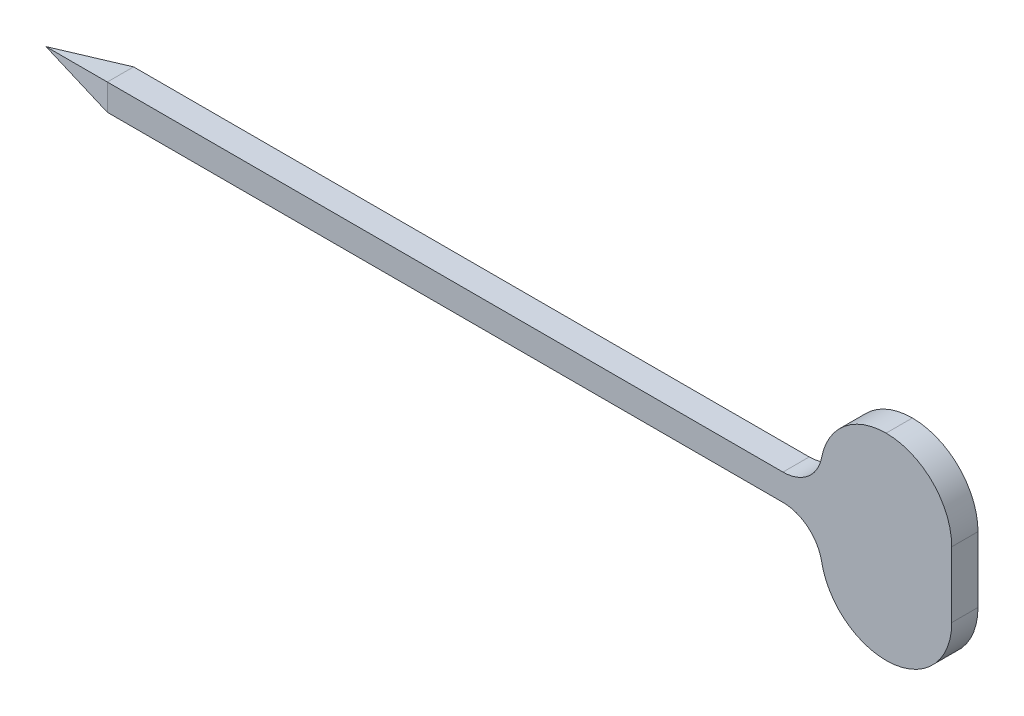
ISO-10303-21;
HEADER;
FILE_DESCRIPTION(('STEP AP214'),'2;1');
FILE_NAME('part.step','',(''),(''),'','','');
FILE_SCHEMA(('AUTOMOTIVE_DESIGN { 1 0 10303 214 1 1 1 1 }'));
ENDSEC;
DATA;
#1=APPLICATION_CONTEXT('core data for automotive mechanical design processes');
#2=APPLICATION_PROTOCOL_DEFINITION('international standard','automotive_design',2000,#1);
#3=PRODUCT_CONTEXT('',#1,'mechanical');
#4=PRODUCT('Part','Part','',(#3));
#5=PRODUCT_RELATED_PRODUCT_CATEGORY('part','',(#4));
#6=PRODUCT_DEFINITION_FORMATION('','',#4);
#7=PRODUCT_DEFINITION_CONTEXT('part definition',#1,'design');
#8=PRODUCT_DEFINITION('design','',#6,#7);
#9=PRODUCT_DEFINITION_SHAPE('','',#8);
#10=(LENGTH_UNIT() NAMED_UNIT(*) SI_UNIT(.MILLI.,.METRE.));
#11=(NAMED_UNIT(*) PLANE_ANGLE_UNIT() SI_UNIT($,.RADIAN.));
#12=(NAMED_UNIT(*) SI_UNIT($,.STERADIAN.) SOLID_ANGLE_UNIT());
#13=UNCERTAINTY_MEASURE_WITH_UNIT(LENGTH_MEASURE(1.E-05),#10,'distance_accuracy_value','');
#14=(GEOMETRIC_REPRESENTATION_CONTEXT(3) GLOBAL_UNCERTAINTY_ASSIGNED_CONTEXT((#13)) GLOBAL_UNIT_ASSIGNED_CONTEXT((#10,
#11,#12)) REPRESENTATION_CONTEXT('',''));
#15=CARTESIAN_POINT('',(0.,0.,0.));
#16=DIRECTION('',(0.,0.,1.));
#17=DIRECTION('',(1.,0.,0.));
#18=AXIS2_PLACEMENT_3D('',#15,#16,#17);
#19=CARTESIAN_POINT('',(0.,-1.,2.));
#20=DIRECTION('',(0.,-1.,0.));
#21=DIRECTION('',(1.,0.,0.));
#22=AXIS2_PLACEMENT_3D('',#19,#20,#21);
#23=PLANE('',#22);
#24=DIRECTION('',(-1.,0.,0.));
#25=VECTOR('',#24,1.);
#26=CARTESIAN_POINT('',(0.,-1.,0.));
#27=LINE('',#26,#25);
#28=CARTESIAN_POINT('',(27.1418831772491,-0.999999999999996,0.));
#29=VERTEX_POINT('',#28);
#30=CARTESIAN_POINT('',(-24.3287181803823,-1.,0.));
#31=VERTEX_POINT('',#30);
#32=EDGE_CURVE('E144',#29,#31,#27,.T.);
#33=ORIENTED_EDGE('',*,*,#32,.F.);
#34=DIRECTION('',(0.,0.,1.));
#35=VECTOR('',#34,1.);
#36=CARTESIAN_POINT('',(27.1418831772491,-0.999999999999996,2.));
#37=LINE('',#36,#35);
#38=CARTESIAN_POINT('',(27.1418831772491,-0.999999999999996,2.));
#39=VERTEX_POINT('',#38);
#40=EDGE_CURVE('E71',#29,#39,#37,.T.);
#41=ORIENTED_EDGE('',*,*,#40,.T.);
#42=DIRECTION('',(-1.,0.,0.));
#43=VECTOR('',#42,1.);
#44=CARTESIAN_POINT('',(0.,-1.,2.));
#45=LINE('',#44,#43);
#46=CARTESIAN_POINT('',(-24.3287181803823,-1.,2.));
#47=VERTEX_POINT('',#46);
#48=EDGE_CURVE('E138',#39,#47,#45,.T.);
#49=ORIENTED_EDGE('',*,*,#48,.T.);
#50=DIRECTION('',(0.,0.,-1.));
#51=VECTOR('',#50,1.);
#52=CARTESIAN_POINT('',(-24.3287181803823,-1.,2.));
#53=LINE('',#52,#51);
#54=EDGE_CURVE('E151',#47,#31,#53,.T.);
#55=ORIENTED_EDGE('',*,*,#54,.T.);
#56=EDGE_LOOP('',(#33,#41,#49,#55));
#57=FACE_BOUND('',#56,.T.);
#58=ADVANCED_FACE('F49',(#57),#23,.T.);
#59=CARTESIAN_POINT('',(40.,0.,2.));
#60=DIRECTION('',(1.,0.,0.));
#61=DIRECTION('',(0.,0.,-1.));
#62=AXIS2_PLACEMENT_3D('',#59,#60,#61);
#63=PLANE('',#62);
#64=DIRECTION('',(0.,-1.,0.));
#65=VECTOR('',#64,1.);
#66=CARTESIAN_POINT('',(40.,0.,2.));
#67=LINE('',#66,#65);
#68=CARTESIAN_POINT('',(40.,2.5,2.));
#69=VERTEX_POINT('',#68);
#70=CARTESIAN_POINT('',(40.,-2.5,2.));
#71=VERTEX_POINT('',#70);
#72=EDGE_CURVE('E243',#69,#71,#67,.T.);
#73=ORIENTED_EDGE('',*,*,#72,.T.);
#74=DIRECTION('',(0.,0.,-1.));
#75=VECTOR('',#74,1.);
#76=CARTESIAN_POINT('',(40.,-2.5,0.));
#77=LINE('',#76,#75);
#78=CARTESIAN_POINT('',(40.,-2.5,0.));
#79=VERTEX_POINT('',#78);
#80=EDGE_CURVE('E188',#71,#79,#77,.T.);
#81=ORIENTED_EDGE('',*,*,#80,.T.);
#82=DIRECTION('',(0.,-1.,0.));
#83=VECTOR('',#82,1.);
#84=CARTESIAN_POINT('',(40.,0.,0.));
#85=LINE('',#84,#83);
#86=CARTESIAN_POINT('',(40.,2.5,0.));
#87=VERTEX_POINT('',#86);
#88=EDGE_CURVE('E139',#87,#79,#85,.T.);
#89=ORIENTED_EDGE('',*,*,#88,.F.);
#90=DIRECTION('',(0.,0.,-1.));
#91=VECTOR('',#90,1.);
#92=CARTESIAN_POINT('',(40.,2.5,2.));
#93=LINE('',#92,#91);
#94=EDGE_CURVE('E150',#87,#69,#93,.F.);
#95=ORIENTED_EDGE('',*,*,#94,.T.);
#96=EDGE_LOOP('',(#73,#81,#89,#95));
#97=FACE_BOUND('',#96,.T.);
#98=ADVANCED_FACE('F259',(#97),#63,.T.);
#99=CARTESIAN_POINT('',(0.,1.,2.));
#100=DIRECTION('',(0.,-1.,0.));
#101=DIRECTION('',(1.,0.,0.));
#102=AXIS2_PLACEMENT_3D('',#99,#100,#101);
#103=PLANE('',#102);
#104=DIRECTION('',(-1.,0.,0.));
#105=VECTOR('',#104,1.);
#106=CARTESIAN_POINT('',(0.,1.,2.));
#107=LINE('',#106,#105);
#108=CARTESIAN_POINT('',(27.1418831772491,1.,2.));
#109=VERTEX_POINT('',#108);
#110=CARTESIAN_POINT('',(-24.3287181803823,0.999999999999997,2.));
#111=VERTEX_POINT('',#110);
#112=EDGE_CURVE('E163',#109,#111,#107,.T.);
#113=ORIENTED_EDGE('',*,*,#112,.F.);
#114=DIRECTION('',(0.,0.,1.));
#115=VECTOR('',#114,1.);
#116=CARTESIAN_POINT('',(27.1418831772491,1.,2.));
#117=LINE('',#116,#115);
#118=CARTESIAN_POINT('',(27.1418831772491,1.,0.));
#119=VERTEX_POINT('',#118);
#120=EDGE_CURVE('E136',#109,#119,#117,.F.);
#121=ORIENTED_EDGE('',*,*,#120,.T.);
#122=DIRECTION('',(-1.,0.,0.));
#123=VECTOR('',#122,1.);
#124=CARTESIAN_POINT('',(0.,1.,0.));
#125=LINE('',#124,#123);
#126=CARTESIAN_POINT('',(-24.3287181803823,0.999999999999997,0.));
#127=VERTEX_POINT('',#126);
#128=EDGE_CURVE('E129',#119,#127,#125,.T.);
#129=ORIENTED_EDGE('',*,*,#128,.T.);
#130=DIRECTION('',(0.,0.,1.));
#131=VECTOR('',#130,1.);
#132=CARTESIAN_POINT('',(-24.3287181803823,0.999999999999997,2.));
#133=LINE('',#132,#131);
#134=EDGE_CURVE('E134',#127,#111,#133,.T.);
#135=ORIENTED_EDGE('',*,*,#134,.T.);
#136=EDGE_LOOP('',(#113,#121,#129,#135));
#137=FACE_BOUND('',#136,.T.);
#138=ADVANCED_FACE('F132',(#137),#103,.F.);
#139=CARTESIAN_POINT('',(0.,0.,2.));
#140=DIRECTION('',(0.,0.,1.));
#141=DIRECTION('',(1.,0.,0.));
#142=AXIS2_PLACEMENT_3D('',#139,#140,#141);
#143=PLANE('',#142);
#144=ORIENTED_EDGE('',*,*,#72,.F.);
#145=CARTESIAN_POINT('',(35.,2.5,2.));
#146=DIRECTION('',(0.,0.,1.));
#147=DIRECTION('',(1.,0.,0.));
#148=AXIS2_PLACEMENT_3D('',#145,#146,#147);
#149=CIRCLE('',#148,5.);
#150=CARTESIAN_POINT('',(35.,7.5,2.));
#151=VERTEX_POINT('',#150);
#152=EDGE_CURVE('E214',#69,#151,#149,.T.);
#153=ORIENTED_EDGE('',*,*,#152,.T.);
#154=CARTESIAN_POINT('',(35.,2.5,2.));
#155=DIRECTION('',(0.,0.,1.));
#156=DIRECTION('',(1.,0.,0.));
#157=AXIS2_PLACEMENT_3D('',#154,#155,#156);
#158=CIRCLE('',#157,5.);
#159=CARTESIAN_POINT('',(30.0886769857807,3.4375,2.));
#160=VERTEX_POINT('',#159);
#161=EDGE_CURVE('E210',#151,#160,#158,.T.);
#162=ORIENTED_EDGE('',*,*,#161,.T.);
#163=CARTESIAN_POINT('',(27.1418831772491,4.,2.));
#164=DIRECTION('',(0.,0.,1.));
#165=DIRECTION('',(1.,0.,0.));
#166=AXIS2_PLACEMENT_3D('',#163,#164,#165);
#167=CIRCLE('',#166,3.);
#168=EDGE_CURVE('E234',#160,#109,#167,.F.);
#169=ORIENTED_EDGE('',*,*,#168,.T.);
#170=ORIENTED_EDGE('',*,*,#112,.T.);
#171=DIRECTION('',(0.,-1.,0.));
#172=VECTOR('',#171,1.);
#173=CARTESIAN_POINT('',(-24.3287181803823,0.,2.));
#174=LINE('',#173,#172);
#175=EDGE_CURVE('E162',#111,#47,#174,.T.);
#176=ORIENTED_EDGE('',*,*,#175,.T.);
#177=ORIENTED_EDGE('',*,*,#48,.F.);
#178=CARTESIAN_POINT('',(27.1418831772491,-4.,2.));
#179=DIRECTION('',(0.,0.,1.));
#180=DIRECTION('',(1.,0.,0.));
#181=AXIS2_PLACEMENT_3D('',#178,#179,#180);
#182=CIRCLE('',#181,3.);
#183=CARTESIAN_POINT('',(30.0886769857807,-3.4375,2.));
#184=VERTEX_POINT('',#183);
#185=EDGE_CURVE('E11',#39,#184,#182,.F.);
#186=ORIENTED_EDGE('',*,*,#185,.T.);
#187=CARTESIAN_POINT('',(35.,-2.5,2.));
#188=DIRECTION('',(0.,0.,1.));
#189=DIRECTION('',(1.,0.,0.));
#190=AXIS2_PLACEMENT_3D('',#187,#188,#189);
#191=CIRCLE('',#190,5.);
#192=CARTESIAN_POINT('',(35.,-7.5,2.));
#193=VERTEX_POINT('',#192);
#194=EDGE_CURVE('E204',#184,#193,#191,.T.);
#195=ORIENTED_EDGE('',*,*,#194,.T.);
#196=CARTESIAN_POINT('',(35.,-2.5,2.));
#197=DIRECTION('',(0.,0.,1.));
#198=DIRECTION('',(1.,0.,0.));
#199=AXIS2_PLACEMENT_3D('',#196,#197,#198);
#200=CIRCLE('',#199,5.);
#201=EDGE_CURVE('E207',#193,#71,#200,.T.);
#202=ORIENTED_EDGE('',*,*,#201,.T.);
#203=EDGE_LOOP('',(#144,#153,#162,#169,#170,#176,#177,#186,#195,#202));
#204=FACE_BOUND('',#203,.T.);
#205=ADVANCED_FACE('F267',(#204),#143,.T.);
#206=CARTESIAN_POINT('',(0.,0.,0.));
#207=DIRECTION('',(0.,0.,1.));
#208=DIRECTION('',(1.,0.,0.));
#209=AXIS2_PLACEMENT_3D('',#206,#207,#208);
#210=PLANE('',#209);
#211=ORIENTED_EDGE('',*,*,#128,.F.);
#212=CARTESIAN_POINT('',(27.1418831772491,4.,0.));
#213=DIRECTION('',(0.,0.,1.));
#214=DIRECTION('',(1.,0.,0.));
#215=AXIS2_PLACEMENT_3D('',#212,#213,#214);
#216=CIRCLE('',#215,3.);
#217=CARTESIAN_POINT('',(30.0886769857807,3.4375,0.));
#218=VERTEX_POINT('',#217);
#219=EDGE_CURVE('E231',#119,#218,#216,.T.);
#220=ORIENTED_EDGE('',*,*,#219,.T.);
#221=CARTESIAN_POINT('',(35.,2.5,0.));
#222=DIRECTION('',(0.,0.,1.));
#223=DIRECTION('',(1.,0.,0.));
#224=AXIS2_PLACEMENT_3D('',#221,#222,#223);
#225=CIRCLE('',#224,5.);
#226=CARTESIAN_POINT('',(35.,7.5,0.));
#227=VERTEX_POINT('',#226);
#228=EDGE_CURVE('E198',#218,#227,#225,.F.);
#229=ORIENTED_EDGE('',*,*,#228,.T.);
#230=CARTESIAN_POINT('',(35.,2.5,0.));
#231=DIRECTION('',(0.,0.,1.));
#232=DIRECTION('',(1.,0.,0.));
#233=AXIS2_PLACEMENT_3D('',#230,#231,#232);
#234=CIRCLE('',#233,5.);
#235=EDGE_CURVE('E201',#227,#87,#234,.F.);
#236=ORIENTED_EDGE('',*,*,#235,.T.);
#237=ORIENTED_EDGE('',*,*,#88,.T.);
#238=CARTESIAN_POINT('',(35.,-2.5,0.));
#239=DIRECTION('',(0.,0.,1.));
#240=DIRECTION('',(1.,0.,0.));
#241=AXIS2_PLACEMENT_3D('',#238,#239,#240);
#242=CIRCLE('',#241,5.);
#243=CARTESIAN_POINT('',(35.,-7.5,0.));
#244=VERTEX_POINT('',#243);
#245=EDGE_CURVE('E195',#79,#244,#242,.F.);
#246=ORIENTED_EDGE('',*,*,#245,.T.);
#247=CARTESIAN_POINT('',(35.,-2.5,0.));
#248=DIRECTION('',(0.,0.,1.));
#249=DIRECTION('',(1.,0.,0.));
#250=AXIS2_PLACEMENT_3D('',#247,#248,#249);
#251=CIRCLE('',#250,5.);
#252=CARTESIAN_POINT('',(30.0886769857807,-3.4375,0.));
#253=VERTEX_POINT('',#252);
#254=EDGE_CURVE('E192',#244,#253,#251,.F.);
#255=ORIENTED_EDGE('',*,*,#254,.T.);
#256=CARTESIAN_POINT('',(27.1418831772491,-4.,0.));
#257=DIRECTION('',(0.,0.,1.));
#258=DIRECTION('',(1.,0.,0.));
#259=AXIS2_PLACEMENT_3D('',#256,#257,#258);
#260=CIRCLE('',#259,3.);
#261=EDGE_CURVE('E58',#253,#29,#260,.T.);
#262=ORIENTED_EDGE('',*,*,#261,.T.);
#263=ORIENTED_EDGE('',*,*,#32,.T.);
#264=DIRECTION('',(0.,1.,0.));
#265=VECTOR('',#264,1.);
#266=CARTESIAN_POINT('',(-24.3287181803823,0.999999999999996,0.));
#267=LINE('',#266,#265);
#268=EDGE_CURVE('E142',#31,#127,#267,.T.);
#269=ORIENTED_EDGE('',*,*,#268,.T.);
#270=EDGE_LOOP('',(#211,#220,#229,#236,#237,#246,#255,#262,#263,#269));
#271=FACE_BOUND('',#270,.T.);
#272=ADVANCED_FACE('F143',(#271),#210,.F.);
#273=CARTESIAN_POINT('',(-24.3287181803823,-1.,2.));
#274=DIRECTION('',(0.173648177666931,0.984807753012208,0.));
#275=DIRECTION('',(0.,0.,-1.));
#276=AXIS2_PLACEMENT_3D('',#273,#274,#275);
#277=PLANE('',#276);
#278=DIRECTION('',(0.970287525247814,-0.171087869746037,-0.171087869746037));
#279=VECTOR('',#278,1.);
#280=CARTESIAN_POINT('',(-24.4947226061181,-0.970728940825766,0.0292710591742368));
#281=LINE('',#280,#279);
#282=CARTESIAN_POINT('',(-30.,0.,1.));
#283=VERTEX_POINT('',#282);
#284=EDGE_CURVE('E167',#31,#283,#281,.F.);
#285=ORIENTED_EDGE('',*,*,#284,.F.);
#286=ORIENTED_EDGE('',*,*,#54,.F.);
#287=DIRECTION('',(-0.970287525247814,0.171087869746037,-0.171087869746037));
#288=VECTOR('',#287,1.);
#289=CARTESIAN_POINT('',(-24.3287181803823,-1.,2.));
#290=LINE('',#289,#288);
#291=EDGE_CURVE('E181',#283,#47,#290,.F.);
#292=ORIENTED_EDGE('',*,*,#291,.F.);
#293=EDGE_LOOP('',(#285,#286,#292));
#294=FACE_BOUND('',#293,.T.);
#295=ADVANCED_FACE('F279',(#294),#277,.F.);
#296=CARTESIAN_POINT('',(-30.,0.,0.999999999999999));
#297=DIRECTION('',(0.173648177666931,0.,-0.984807753012208));
#298=DIRECTION('',(0.,1.,0.));
#299=AXIS2_PLACEMENT_3D('',#296,#297,#298);
#300=PLANE('',#299);
#301=ORIENTED_EDGE('',*,*,#291,.T.);
#302=ORIENTED_EDGE('',*,*,#175,.F.);
#303=DIRECTION('',(0.970287525247814,0.171087869746037,0.171087869746037));
#304=VECTOR('',#303,1.);
#305=CARTESIAN_POINT('',(-30.,0.,0.999999999999999));
#306=LINE('',#305,#304);
#307=EDGE_CURVE('E159',#283,#111,#306,.T.);
#308=ORIENTED_EDGE('',*,*,#307,.F.);
#309=EDGE_LOOP('',(#301,#302,#308));
#310=FACE_BOUND('',#309,.T.);
#311=ADVANCED_FACE('F280',(#310),#300,.F.);
#312=CARTESIAN_POINT('',(-24.3287181803823,0.,0.));
#313=DIRECTION('',(-0.173648177666931,0.,-0.984807753012208));
#314=DIRECTION('',(0.,-1.,0.));
#315=AXIS2_PLACEMENT_3D('',#312,#313,#314);
#316=PLANE('',#315);
#317=ORIENTED_EDGE('',*,*,#268,.F.);
#318=ORIENTED_EDGE('',*,*,#284,.T.);
#319=DIRECTION('',(0.970287525247814,0.171087869746037,-0.171087869746037));
#320=VECTOR('',#319,1.);
#321=CARTESIAN_POINT('',(-24.4947226061181,0.97072894082576,0.0292710591742367));
#322=LINE('',#321,#320);
#323=EDGE_CURVE('E157',#127,#283,#322,.F.);
#324=ORIENTED_EDGE('',*,*,#323,.F.);
#325=EDGE_LOOP('',(#317,#318,#324));
#326=FACE_BOUND('',#325,.T.);
#327=ADVANCED_FACE('F165',(#326),#316,.T.);
#328=CARTESIAN_POINT('',(-30.,0.,2.));
#329=DIRECTION('',(-0.173648177666931,0.984807753012208,0.));
#330=DIRECTION('',(0.,0.,1.));
#331=AXIS2_PLACEMENT_3D('',#328,#329,#330);
#332=PLANE('',#331);
#333=ORIENTED_EDGE('',*,*,#307,.T.);
#334=ORIENTED_EDGE('',*,*,#134,.F.);
#335=ORIENTED_EDGE('',*,*,#323,.T.);
#336=EDGE_LOOP('',(#333,#334,#335));
#337=FACE_BOUND('',#336,.T.);
#338=ADVANCED_FACE('F156',(#337),#332,.T.);
#339=CARTESIAN_POINT('',(35.,-2.5,2.));
#340=DIRECTION('',(0.,0.,-1.));
#341=DIRECTION('',(-1.,0.,0.));
#342=AXIS2_PLACEMENT_3D('',#339,#340,#341);
#343=CYLINDRICAL_SURFACE('',#342,5.);
#344=ORIENTED_EDGE('',*,*,#194,.F.);
#345=DIRECTION('',(0.,0.,-1.));
#346=VECTOR('',#345,1.);
#347=CARTESIAN_POINT('',(30.0886769857807,-3.4375,2.));
#348=LINE('',#347,#346);
#349=EDGE_CURVE('E225',#184,#253,#348,.T.);
#350=ORIENTED_EDGE('',*,*,#349,.T.);
#351=ORIENTED_EDGE('',*,*,#254,.F.);
#352=DIRECTION('',(0.,0.,-1.));
#353=VECTOR('',#352,1.);
#354=CARTESIAN_POINT('',(35.,-7.5,2.));
#355=LINE('',#354,#353);
#356=EDGE_CURVE('E169',#193,#244,#355,.T.);
#357=ORIENTED_EDGE('',*,*,#356,.F.);
#358=EDGE_LOOP('',(#344,#350,#351,#357));
#359=FACE_BOUND('',#358,.T.);
#360=ADVANCED_FACE('F305',(#359),#343,.T.);
#361=CARTESIAN_POINT('',(35.,-2.5,2.));
#362=DIRECTION('',(0.,0.,1.));
#363=DIRECTION('',(1.,0.,0.));
#364=AXIS2_PLACEMENT_3D('',#361,#362,#363);
#365=CYLINDRICAL_SURFACE('',#364,5.);
#366=ORIENTED_EDGE('',*,*,#201,.F.);
#367=ORIENTED_EDGE('',*,*,#356,.T.);
#368=ORIENTED_EDGE('',*,*,#245,.F.);
#369=ORIENTED_EDGE('',*,*,#80,.F.);
#370=EDGE_LOOP('',(#366,#367,#368,#369));
#371=FACE_BOUND('',#370,.T.);
#372=ADVANCED_FACE('F314',(#371),#365,.T.);
#373=CARTESIAN_POINT('',(35.,2.5,2.));
#374=DIRECTION('',(0.,0.,1.));
#375=DIRECTION('',(1.,0.,0.));
#376=AXIS2_PLACEMENT_3D('',#373,#374,#375);
#377=CYLINDRICAL_SURFACE('',#376,5.);
#378=ORIENTED_EDGE('',*,*,#228,.F.);
#379=DIRECTION('',(0.,0.,1.));
#380=VECTOR('',#379,1.);
#381=CARTESIAN_POINT('',(30.0886769857807,3.4375,2.));
#382=LINE('',#381,#380);
#383=EDGE_CURVE('E222',#218,#160,#382,.T.);
#384=ORIENTED_EDGE('',*,*,#383,.T.);
#385=ORIENTED_EDGE('',*,*,#161,.F.);
#386=DIRECTION('',(0.,0.,-1.));
#387=VECTOR('',#386,1.);
#388=CARTESIAN_POINT('',(35.,7.5,2.));
#389=LINE('',#388,#387);
#390=EDGE_CURVE('E175',#227,#151,#389,.F.);
#391=ORIENTED_EDGE('',*,*,#390,.F.);
#392=EDGE_LOOP('',(#378,#384,#385,#391));
#393=FACE_BOUND('',#392,.T.);
#394=ADVANCED_FACE('F271',(#393),#377,.T.);
#395=CARTESIAN_POINT('',(35.,2.5,2.));
#396=DIRECTION('',(0.,0.,-1.));
#397=DIRECTION('',(-1.,0.,0.));
#398=AXIS2_PLACEMENT_3D('',#395,#396,#397);
#399=CYLINDRICAL_SURFACE('',#398,5.);
#400=ORIENTED_EDGE('',*,*,#152,.F.);
#401=ORIENTED_EDGE('',*,*,#94,.F.);
#402=ORIENTED_EDGE('',*,*,#235,.F.);
#403=ORIENTED_EDGE('',*,*,#390,.T.);
#404=EDGE_LOOP('',(#400,#401,#402,#403));
#405=FACE_BOUND('',#404,.T.);
#406=ADVANCED_FACE('F263',(#405),#399,.T.);
#407=CARTESIAN_POINT('',(27.1418831772491,4.,2.));
#408=DIRECTION('',(0.,0.,1.));
#409=DIRECTION('',(1.,0.,0.));
#410=AXIS2_PLACEMENT_3D('',#407,#408,#409);
#411=CYLINDRICAL_SURFACE('',#410,3.);
#412=ORIENTED_EDGE('',*,*,#168,.F.);
#413=ORIENTED_EDGE('',*,*,#383,.F.);
#414=ORIENTED_EDGE('',*,*,#219,.F.);
#415=ORIENTED_EDGE('',*,*,#120,.F.);
#416=EDGE_LOOP('',(#412,#413,#414,#415));
#417=FACE_BOUND('',#416,.T.);
#418=ADVANCED_FACE('F274',(#417),#411,.F.);
#419=CARTESIAN_POINT('',(27.1418831772491,-4.,2.));
#420=DIRECTION('',(0.,0.,-1.));
#421=DIRECTION('',(-1.,0.,0.));
#422=AXIS2_PLACEMENT_3D('',#419,#420,#421);
#423=CYLINDRICAL_SURFACE('',#422,3.);
#424=ORIENTED_EDGE('',*,*,#185,.F.);
#425=ORIENTED_EDGE('',*,*,#40,.F.);
#426=ORIENTED_EDGE('',*,*,#261,.F.);
#427=ORIENTED_EDGE('',*,*,#349,.F.);
#428=EDGE_LOOP('',(#424,#425,#426,#427));
#429=FACE_BOUND('',#428,.T.);
#430=ADVANCED_FACE('F51',(#429),#423,.F.);
#431=CLOSED_SHELL('',(#58,#98,#138,#205,#272,#295,#311,#327,#338,#360,#372,#394,#406,#418,#430));
#432=MANIFOLD_SOLID_BREP('B2',#431);
#433=ADVANCED_BREP_SHAPE_REPRESENTATION('',(#18,#432),#14);
#434=SHAPE_DEFINITION_REPRESENTATION(#9,#433);
ENDSEC;
END-ISO-10303-21;
